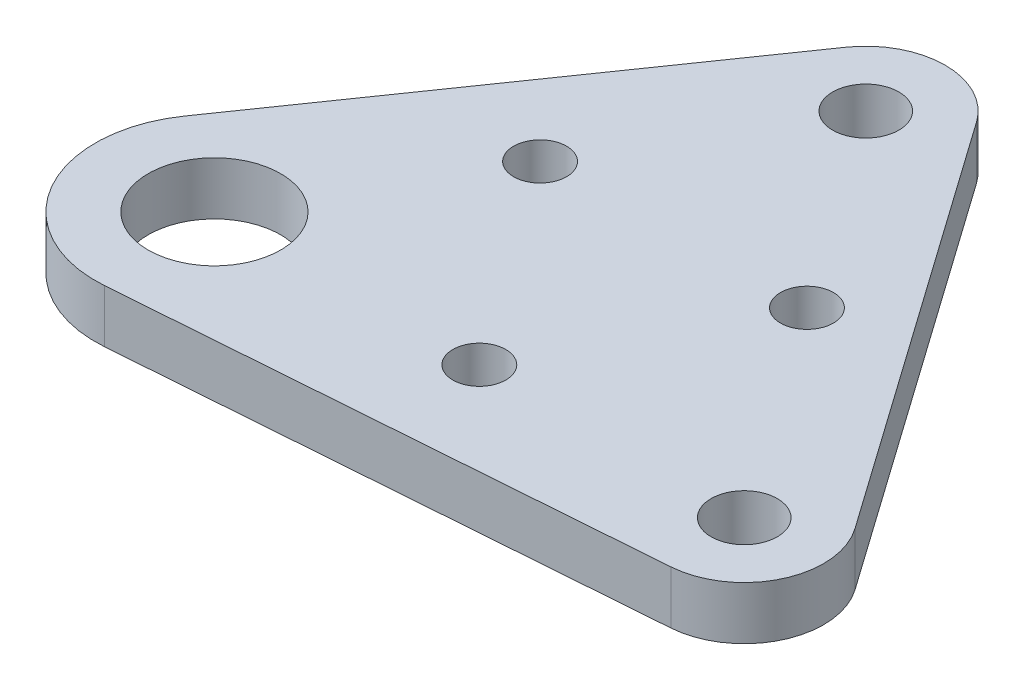
ISO-10303-21;
HEADER;
FILE_DESCRIPTION(('STEP AP214'),'2;1');
FILE_NAME('part.step','',(''),(''),'','','');
FILE_SCHEMA(('AUTOMOTIVE_DESIGN { 1 0 10303 214 1 1 1 1 }'));
ENDSEC;
DATA;
#1=APPLICATION_CONTEXT('core data for automotive mechanical design processes');
#2=APPLICATION_PROTOCOL_DEFINITION('international standard','automotive_design',2000,#1);
#3=PRODUCT_CONTEXT('',#1,'mechanical');
#4=PRODUCT('Part','Part','',(#3));
#5=PRODUCT_RELATED_PRODUCT_CATEGORY('part','',(#4));
#6=PRODUCT_DEFINITION_FORMATION('','',#4);
#7=PRODUCT_DEFINITION_CONTEXT('part definition',#1,'design');
#8=PRODUCT_DEFINITION('design','',#6,#7);
#9=PRODUCT_DEFINITION_SHAPE('','',#8);
#10=(LENGTH_UNIT() NAMED_UNIT(*) SI_UNIT(.MILLI.,.METRE.));
#11=(NAMED_UNIT(*) PLANE_ANGLE_UNIT() SI_UNIT($,.RADIAN.));
#12=(NAMED_UNIT(*) SI_UNIT($,.STERADIAN.) SOLID_ANGLE_UNIT());
#13=UNCERTAINTY_MEASURE_WITH_UNIT(LENGTH_MEASURE(1.E-05),#10,'distance_accuracy_value','');
#14=(GEOMETRIC_REPRESENTATION_CONTEXT(3) GLOBAL_UNCERTAINTY_ASSIGNED_CONTEXT((#13)) GLOBAL_UNIT_ASSIGNED_CONTEXT((#10,
#11,#12)) REPRESENTATION_CONTEXT('',''));
#15=CARTESIAN_POINT('',(0.,0.,0.));
#16=DIRECTION('',(0.,0.,1.));
#17=DIRECTION('',(1.,0.,0.));
#18=AXIS2_PLACEMENT_3D('',#15,#16,#17);
#19=CARTESIAN_POINT('',(63.5,6.35,0.));
#20=DIRECTION('',(0.,1.,0.));
#21=DIRECTION('',(0.,0.,1.));
#22=AXIS2_PLACEMENT_3D('',#19,#20,#21);
#23=PLANE('',#22);
#24=CARTESIAN_POINT('',(31.75,6.35,0.));
#25=DIRECTION('',(0.,1.,0.));
#26=DIRECTION('',(0.,0.,1.));
#27=AXIS2_PLACEMENT_3D('',#24,#25,#26);
#28=CIRCLE('',#27,3.175);
#29=CARTESIAN_POINT('',(31.75,6.35,3.175));
#30=VERTEX_POINT('',#29);
#31=EDGE_CURVE('E196',#30,#30,#28,.T.);
#32=ORIENTED_EDGE('',*,*,#31,.F.);
#33=EDGE_LOOP('',(#32));
#34=FACE_BOUND('',#33,.T.);
#35=CARTESIAN_POINT('',(63.5,6.35,0.));
#36=DIRECTION('',(0.,1.,0.));
#37=DIRECTION('',(0.,0.,1.));
#38=AXIS2_PLACEMENT_3D('',#35,#36,#37);
#39=CIRCLE('',#38,3.96875);
#40=CARTESIAN_POINT('',(63.5,6.35,3.96875));
#41=VERTEX_POINT('',#40);
#42=EDGE_CURVE('E208',#41,#41,#39,.T.);
#43=ORIENTED_EDGE('',*,*,#42,.F.);
#44=EDGE_LOOP('',(#43));
#45=FACE_BOUND('',#44,.T.);
#46=CARTESIAN_POINT('',(28.5750000000002,6.35,-49.4933518262805));
#47=DIRECTION('',(0.,1.,0.));
#48=DIRECTION('',(0.,0.,1.));
#49=AXIS2_PLACEMENT_3D('',#46,#47,#48);
#50=CIRCLE('',#49,3.96874999999999);
#51=CARTESIAN_POINT('',(28.5750000000002,6.35,-45.5246018262805));
#52=VERTEX_POINT('',#51);
#53=EDGE_CURVE('E120',#52,#52,#50,.T.);
#54=ORIENTED_EDGE('',*,*,#53,.F.);
#55=EDGE_LOOP('',(#54));
#56=FACE_BOUND('',#55,.T.);
#57=CARTESIAN_POINT('',(63.5,6.35,0.));
#58=DIRECTION('',(0.,1.,0.));
#59=DIRECTION('',(0.,0.,1.));
#60=AXIS2_PLACEMENT_3D('',#57,#58,#59);
#61=CIRCLE('',#60,9.52500000000001);
#62=CARTESIAN_POINT('',(64.214375,6.35,9.49817315905407));
#63=VERTEX_POINT('',#62);
#64=CARTESIAN_POINT('',(71.282469535705,6.35,-5.49170218837694));
#65=VERTEX_POINT('',#64);
#66=EDGE_CURVE('E127',#63,#65,#61,.T.);
#67=ORIENTED_EDGE('',*,*,#66,.T.);
#68=DIRECTION('',(-0.576556660197054,0.,-0.817057169102884));
#69=VECTOR('',#68,1.);
#70=CARTESIAN_POINT('',(36.3574695357052,6.35,-54.9850540146575));
#71=LINE('',#70,#69);
#72=CARTESIAN_POINT('',(36.3574695357052,6.35,-54.9850540146575));
#73=VERTEX_POINT('',#72);
#74=EDGE_CURVE('E85',#65,#73,#71,.T.);
#75=ORIENTED_EDGE('',*,*,#74,.T.);
#76=CARTESIAN_POINT('',(28.5750000000002,6.35,-49.4933518262805));
#77=DIRECTION('',(0.,1.,0.));
#78=DIRECTION('',(0.,0.,1.));
#79=AXIS2_PLACEMENT_3D('',#76,#77,#78);
#80=CIRCLE('',#79,9.52499999999999);
#81=CARTESIAN_POINT('',(20.7516749140458,6.35,-54.9266942229528));
#82=VERTEX_POINT('',#81);
#83=EDGE_CURVE('E98',#73,#82,#80,.T.);
#84=ORIENTED_EDGE('',*,*,#83,.T.);
#85=DIRECTION('',(-0.570429647944599,0.,0.821346465716996));
#86=VECTOR('',#85,1.);
#87=CARTESIAN_POINT('',(-11.7349876289316,6.35,-8.15001359500845));
#88=LINE('',#87,#86);
#89=CARTESIAN_POINT('',(-11.7349876289316,6.35,-8.15001359500845));
#90=VERTEX_POINT('',#89);
#91=EDGE_CURVE('E92',#82,#90,#88,.T.);
#92=ORIENTED_EDGE('',*,*,#91,.T.);
#93=CARTESIAN_POINT('',(0.,6.35,0.));
#94=DIRECTION('',(0.,1.,0.));
#95=DIRECTION('',(0.,0.,1.));
#96=AXIS2_PLACEMENT_3D('',#93,#94,#95);
#97=CIRCLE('',#96,14.2875);
#98=CARTESIAN_POINT('',(1.0715625,6.35,14.2472597385811));
#99=VERTEX_POINT('',#98);
#100=EDGE_CURVE('E96',#90,#99,#97,.T.);
#101=ORIENTED_EDGE('',*,*,#100,.T.);
#102=DIRECTION('',(0.997183533758957,0.,-0.075));
#103=VECTOR('',#102,1.);
#104=CARTESIAN_POINT('',(1.0715625,6.35,14.2472597385811));
#105=LINE('',#104,#103);
#106=EDGE_CURVE('E48',#99,#63,#105,.T.);
#107=ORIENTED_EDGE('',*,*,#106,.T.);
#108=EDGE_LOOP('',(#67,#75,#84,#92,#101,#107));
#109=FACE_BOUND('',#108,.T.);
#110=CARTESIAN_POINT('',(0.,6.35,0.));
#111=DIRECTION('',(0.,1.,0.));
#112=DIRECTION('',(0.,0.,1.));
#113=AXIS2_PLACEMENT_3D('',#110,#111,#112);
#114=CIRCLE('',#113,7.9375);
#115=CARTESIAN_POINT('',(0.,6.35,7.9375));
#116=VERTEX_POINT('',#115);
#117=EDGE_CURVE('E214',#116,#116,#114,.T.);
#118=ORIENTED_EDGE('',*,*,#117,.F.);
#119=EDGE_LOOP('',(#118));
#120=FACE_BOUND('',#119,.T.);
#121=CARTESIAN_POINT('',(14.2875000000001,6.35,-24.7466759131403));
#122=DIRECTION('',(0.,1.,0.));
#123=DIRECTION('',(0.,0.,1.));
#124=AXIS2_PLACEMENT_3D('',#121,#122,#123);
#125=CIRCLE('',#124,3.175);
#126=CARTESIAN_POINT('',(14.2875000000001,6.35,-21.5716759131403));
#127=VERTEX_POINT('',#126);
#128=EDGE_CURVE('E202',#127,#127,#125,.T.);
#129=ORIENTED_EDGE('',*,*,#128,.F.);
#130=EDGE_LOOP('',(#129));
#131=FACE_BOUND('',#130,.T.);
#132=CARTESIAN_POINT('',(45.471967278667,6.35,-25.5481107004335));
#133=DIRECTION('',(0.,1.,0.));
#134=DIRECTION('',(0.,0.,1.));
#135=AXIS2_PLACEMENT_3D('',#132,#133,#134);
#136=CIRCLE('',#135,3.175);
#137=CARTESIAN_POINT('',(45.471967278667,6.35,-22.3731107004335));
#138=VERTEX_POINT('',#137);
#139=EDGE_CURVE('E187',#138,#138,#136,.T.);
#140=ORIENTED_EDGE('',*,*,#139,.F.);
#141=EDGE_LOOP('',(#140));
#142=FACE_BOUND('',#141,.T.);
#143=ADVANCED_FACE('F31',(#34,#45,#56,#109,#120,#131,#142),#23,.T.);
#144=CARTESIAN_POINT('',(63.5,0.,0.));
#145=DIRECTION('',(0.,1.,0.));
#146=DIRECTION('',(0.,0.,1.));
#147=AXIS2_PLACEMENT_3D('',#144,#145,#146);
#148=PLANE('',#147);
#149=CARTESIAN_POINT('',(31.75,0.,0.));
#150=DIRECTION('',(0.,1.,0.));
#151=DIRECTION('',(0.,0.,1.));
#152=AXIS2_PLACEMENT_3D('',#149,#150,#151);
#153=CIRCLE('',#152,3.175);
#154=CARTESIAN_POINT('',(31.75,0.,3.175));
#155=VERTEX_POINT('',#154);
#156=EDGE_CURVE('E193',#155,#155,#153,.T.);
#157=ORIENTED_EDGE('',*,*,#156,.T.);
#158=EDGE_LOOP('',(#157));
#159=FACE_BOUND('',#158,.T.);
#160=CARTESIAN_POINT('',(63.5,0.,0.));
#161=DIRECTION('',(0.,1.,0.));
#162=DIRECTION('',(0.,0.,1.));
#163=AXIS2_PLACEMENT_3D('',#160,#161,#162);
#164=CIRCLE('',#163,3.96875);
#165=CARTESIAN_POINT('',(63.5,0.,3.96875));
#166=VERTEX_POINT('',#165);
#167=EDGE_CURVE('E205',#166,#166,#164,.T.);
#168=ORIENTED_EDGE('',*,*,#167,.T.);
#169=EDGE_LOOP('',(#168));
#170=FACE_BOUND('',#169,.T.);
#171=CARTESIAN_POINT('',(28.5750000000002,0.,-49.4933518262805));
#172=DIRECTION('',(0.,1.,0.));
#173=DIRECTION('',(0.,0.,1.));
#174=AXIS2_PLACEMENT_3D('',#171,#172,#173);
#175=CIRCLE('',#174,3.96874999999999);
#176=CARTESIAN_POINT('',(28.5750000000002,0.,-45.5246018262805));
#177=VERTEX_POINT('',#176);
#178=EDGE_CURVE('E217',#177,#177,#175,.T.);
#179=ORIENTED_EDGE('',*,*,#178,.T.);
#180=EDGE_LOOP('',(#179));
#181=FACE_BOUND('',#180,.T.);
#182=CARTESIAN_POINT('',(63.5,0.,0.));
#183=DIRECTION('',(0.,1.,0.));
#184=DIRECTION('',(0.,0.,1.));
#185=AXIS2_PLACEMENT_3D('',#182,#183,#184);
#186=CIRCLE('',#185,9.52500000000001);
#187=CARTESIAN_POINT('',(64.214375,0.,9.49817315905407));
#188=VERTEX_POINT('',#187);
#189=CARTESIAN_POINT('',(71.282469535705,0.,-5.49170218837694));
#190=VERTEX_POINT('',#189);
#191=EDGE_CURVE('E116',#188,#190,#186,.T.);
#192=ORIENTED_EDGE('',*,*,#191,.F.);
#193=DIRECTION('',(0.997183533758957,0.,-0.075));
#194=VECTOR('',#193,1.);
#195=CARTESIAN_POINT('',(1.0715625,0.,14.2472597385811));
#196=LINE('',#195,#194);
#197=CARTESIAN_POINT('',(1.0715625,0.,14.2472597385811));
#198=VERTEX_POINT('',#197);
#199=EDGE_CURVE('E77',#198,#188,#196,.T.);
#200=ORIENTED_EDGE('',*,*,#199,.F.);
#201=CARTESIAN_POINT('',(0.,0.,0.));
#202=DIRECTION('',(0.,1.,0.));
#203=DIRECTION('',(0.,0.,1.));
#204=AXIS2_PLACEMENT_3D('',#201,#202,#203);
#205=CIRCLE('',#204,14.2875);
#206=CARTESIAN_POINT('',(-11.7349876289316,0.,-8.15001359500845));
#207=VERTEX_POINT('',#206);
#208=EDGE_CURVE('E71',#207,#198,#205,.T.);
#209=ORIENTED_EDGE('',*,*,#208,.F.);
#210=DIRECTION('',(-0.570429647944599,0.,0.821346465716996));
#211=VECTOR('',#210,1.);
#212=CARTESIAN_POINT('',(-11.7349876289316,0.,-8.15001359500845));
#213=LINE('',#212,#211);
#214=CARTESIAN_POINT('',(20.7516749140458,0.,-54.9266942229528));
#215=VERTEX_POINT('',#214);
#216=EDGE_CURVE('E106',#215,#207,#213,.T.);
#217=ORIENTED_EDGE('',*,*,#216,.F.);
#218=CARTESIAN_POINT('',(28.5750000000002,0.,-49.4933518262805));
#219=DIRECTION('',(0.,1.,0.));
#220=DIRECTION('',(0.,0.,1.));
#221=AXIS2_PLACEMENT_3D('',#218,#219,#220);
#222=CIRCLE('',#221,9.52499999999999);
#223=CARTESIAN_POINT('',(36.3574695357052,0.,-54.9850540146575));
#224=VERTEX_POINT('',#223);
#225=EDGE_CURVE('E122',#224,#215,#222,.T.);
#226=ORIENTED_EDGE('',*,*,#225,.F.);
#227=DIRECTION('',(-0.576556660197054,0.,-0.817057169102884));
#228=VECTOR('',#227,1.);
#229=CARTESIAN_POINT('',(36.3574695357052,0.,-54.9850540146575));
#230=LINE('',#229,#228);
#231=EDGE_CURVE('E119',#190,#224,#230,.T.);
#232=ORIENTED_EDGE('',*,*,#231,.F.);
#233=EDGE_LOOP('',(#192,#200,#209,#217,#226,#232));
#234=FACE_BOUND('',#233,.T.);
#235=CARTESIAN_POINT('',(0.,0.,0.));
#236=DIRECTION('',(0.,1.,0.));
#237=DIRECTION('',(0.,0.,1.));
#238=AXIS2_PLACEMENT_3D('',#235,#236,#237);
#239=CIRCLE('',#238,7.9375);
#240=CARTESIAN_POINT('',(0.,0.,7.9375));
#241=VERTEX_POINT('',#240);
#242=EDGE_CURVE('E211',#241,#241,#239,.T.);
#243=ORIENTED_EDGE('',*,*,#242,.T.);
#244=EDGE_LOOP('',(#243));
#245=FACE_BOUND('',#244,.T.);
#246=CARTESIAN_POINT('',(14.2875000000001,0.,-24.7466759131403));
#247=DIRECTION('',(0.,1.,0.));
#248=DIRECTION('',(0.,0.,1.));
#249=AXIS2_PLACEMENT_3D('',#246,#247,#248);
#250=CIRCLE('',#249,3.175);
#251=CARTESIAN_POINT('',(14.2875000000001,0.,-21.5716759131403));
#252=VERTEX_POINT('',#251);
#253=EDGE_CURVE('E199',#252,#252,#250,.T.);
#254=ORIENTED_EDGE('',*,*,#253,.T.);
#255=EDGE_LOOP('',(#254));
#256=FACE_BOUND('',#255,.T.);
#257=CARTESIAN_POINT('',(45.471967278667,0.,-25.5481107004335));
#258=DIRECTION('',(0.,1.,0.));
#259=DIRECTION('',(0.,0.,1.));
#260=AXIS2_PLACEMENT_3D('',#257,#258,#259);
#261=CIRCLE('',#260,3.175);
#262=CARTESIAN_POINT('',(45.471967278667,0.,-22.3731107004335));
#263=VERTEX_POINT('',#262);
#264=EDGE_CURVE('E190',#263,#263,#261,.T.);
#265=ORIENTED_EDGE('',*,*,#264,.T.);
#266=EDGE_LOOP('',(#265));
#267=FACE_BOUND('',#266,.T.);
#268=ADVANCED_FACE('F136',(#159,#170,#181,#234,#245,#256,#267),#148,.F.);
#269=CARTESIAN_POINT('',(63.5,6.35,0.));
#270=DIRECTION('',(0.,-1.,0.));
#271=DIRECTION('',(0.,0.,-1.));
#272=AXIS2_PLACEMENT_3D('',#269,#270,#271);
#273=CYLINDRICAL_SURFACE('',#272,9.52500000000001);
#274=ORIENTED_EDGE('',*,*,#191,.T.);
#275=DIRECTION('',(0.,-1.,0.));
#276=VECTOR('',#275,1.);
#277=CARTESIAN_POINT('',(71.282469535705,6.35,-5.49170218837694));
#278=LINE('',#277,#276);
#279=EDGE_CURVE('E11',#65,#190,#278,.T.);
#280=ORIENTED_EDGE('',*,*,#279,.F.);
#281=ORIENTED_EDGE('',*,*,#66,.F.);
#282=DIRECTION('',(0.,-1.,0.));
#283=VECTOR('',#282,1.);
#284=CARTESIAN_POINT('',(64.214375,6.35,9.49817315905407));
#285=LINE('',#284,#283);
#286=EDGE_CURVE('E112',#63,#188,#285,.T.);
#287=ORIENTED_EDGE('',*,*,#286,.T.);
#288=EDGE_LOOP('',(#274,#280,#281,#287));
#289=FACE_BOUND('',#288,.T.);
#290=ADVANCED_FACE('F33',(#289),#273,.T.);
#291=CARTESIAN_POINT('',(36.3574695357052,6.35,-54.9850540146575));
#292=DIRECTION('',(-0.817057169102884,0.,0.576556660197054));
#293=DIRECTION('',(0.576556660197054,0.,0.817057169102884));
#294=AXIS2_PLACEMENT_3D('',#291,#292,#293);
#295=PLANE('',#294);
#296=ORIENTED_EDGE('',*,*,#231,.T.);
#297=DIRECTION('',(0.,-1.,0.));
#298=VECTOR('',#297,1.);
#299=CARTESIAN_POINT('',(36.3574695357052,6.35,-54.9850540146575));
#300=LINE('',#299,#298);
#301=EDGE_CURVE('E40',#73,#224,#300,.T.);
#302=ORIENTED_EDGE('',*,*,#301,.F.);
#303=ORIENTED_EDGE('',*,*,#74,.F.);
#304=ORIENTED_EDGE('',*,*,#279,.T.);
#305=EDGE_LOOP('',(#296,#302,#303,#304));
#306=FACE_BOUND('',#305,.T.);
#307=ADVANCED_FACE('F292',(#306),#295,.F.);
#308=CARTESIAN_POINT('',(28.5750000000002,6.35,-49.4933518262805));
#309=DIRECTION('',(0.,-1.,0.));
#310=DIRECTION('',(0.,0.,-1.));
#311=AXIS2_PLACEMENT_3D('',#308,#309,#310);
#312=CYLINDRICAL_SURFACE('',#311,9.52499999999999);
#313=ORIENTED_EDGE('',*,*,#225,.T.);
#314=DIRECTION('',(0.,-1.,0.));
#315=VECTOR('',#314,1.);
#316=CARTESIAN_POINT('',(20.7516749140458,6.35,-54.9266942229528));
#317=LINE('',#316,#315);
#318=EDGE_CURVE('E107',#82,#215,#317,.T.);
#319=ORIENTED_EDGE('',*,*,#318,.F.);
#320=ORIENTED_EDGE('',*,*,#83,.F.);
#321=ORIENTED_EDGE('',*,*,#301,.T.);
#322=EDGE_LOOP('',(#313,#319,#320,#321));
#323=FACE_BOUND('',#322,.T.);
#324=ADVANCED_FACE('F133',(#323),#312,.T.);
#325=CARTESIAN_POINT('',(-11.7349876289316,6.35,-8.15001359500845));
#326=DIRECTION('',(0.821346465716996,0.,0.570429647944599));
#327=DIRECTION('',(0.570429647944599,0.,-0.821346465716996));
#328=AXIS2_PLACEMENT_3D('',#325,#326,#327);
#329=PLANE('',#328);
#330=ORIENTED_EDGE('',*,*,#216,.T.);
#331=DIRECTION('',(0.,-1.,0.));
#332=VECTOR('',#331,1.);
#333=CARTESIAN_POINT('',(-11.7349876289316,6.35,-8.15001359500845));
#334=LINE('',#333,#332);
#335=EDGE_CURVE('E103',#90,#207,#334,.T.);
#336=ORIENTED_EDGE('',*,*,#335,.F.);
#337=ORIENTED_EDGE('',*,*,#91,.F.);
#338=ORIENTED_EDGE('',*,*,#318,.T.);
#339=EDGE_LOOP('',(#330,#336,#337,#338));
#340=FACE_BOUND('',#339,.T.);
#341=ADVANCED_FACE('F104',(#340),#329,.F.);
#342=CARTESIAN_POINT('',(0.,6.35,0.));
#343=DIRECTION('',(0.,-1.,0.));
#344=DIRECTION('',(0.,0.,-1.));
#345=AXIS2_PLACEMENT_3D('',#342,#343,#344);
#346=CYLINDRICAL_SURFACE('',#345,14.2875);
#347=ORIENTED_EDGE('',*,*,#208,.T.);
#348=DIRECTION('',(0.,-1.,0.));
#349=VECTOR('',#348,1.);
#350=CARTESIAN_POINT('',(1.0715625,6.35,14.2472597385811));
#351=LINE('',#350,#349);
#352=EDGE_CURVE('E108',#99,#198,#351,.T.);
#353=ORIENTED_EDGE('',*,*,#352,.F.);
#354=ORIENTED_EDGE('',*,*,#100,.F.);
#355=ORIENTED_EDGE('',*,*,#335,.T.);
#356=EDGE_LOOP('',(#347,#353,#354,#355));
#357=FACE_BOUND('',#356,.T.);
#358=ADVANCED_FACE('F110',(#357),#346,.T.);
#359=CARTESIAN_POINT('',(1.0715625,6.35,14.2472597385811));
#360=DIRECTION('',(-0.075,0.,-0.997183533758957));
#361=DIRECTION('',(-0.997183533758957,0.,0.075));
#362=AXIS2_PLACEMENT_3D('',#359,#360,#361);
#363=PLANE('',#362);
#364=ORIENTED_EDGE('',*,*,#199,.T.);
#365=ORIENTED_EDGE('',*,*,#286,.F.);
#366=ORIENTED_EDGE('',*,*,#106,.F.);
#367=ORIENTED_EDGE('',*,*,#352,.T.);
#368=EDGE_LOOP('',(#364,#365,#366,#367));
#369=FACE_BOUND('',#368,.T.);
#370=ADVANCED_FACE('F141',(#369),#363,.F.);
#371=CARTESIAN_POINT('',(28.5750000000002,6.35,-49.4933518262805));
#372=DIRECTION('',(0.,-1.,0.));
#373=DIRECTION('',(0.,0.,-1.));
#374=AXIS2_PLACEMENT_3D('',#371,#372,#373);
#375=CYLINDRICAL_SURFACE('',#374,3.96874999999999);
#376=ORIENTED_EDGE('',*,*,#53,.T.);
#377=EDGE_LOOP('',(#376));
#378=FACE_BOUND('',#377,.T.);
#379=ORIENTED_EDGE('',*,*,#178,.F.);
#380=EDGE_LOOP('',(#379));
#381=FACE_BOUND('',#380,.T.);
#382=ADVANCED_FACE('F143',(#378,#381),#375,.F.);
#383=CARTESIAN_POINT('',(0.,6.35,0.));
#384=DIRECTION('',(0.,-1.,0.));
#385=DIRECTION('',(0.,0.,-1.));
#386=AXIS2_PLACEMENT_3D('',#383,#384,#385);
#387=CYLINDRICAL_SURFACE('',#386,7.9375);
#388=ORIENTED_EDGE('',*,*,#117,.T.);
#389=EDGE_LOOP('',(#388));
#390=FACE_BOUND('',#389,.T.);
#391=ORIENTED_EDGE('',*,*,#242,.F.);
#392=EDGE_LOOP('',(#391));
#393=FACE_BOUND('',#392,.T.);
#394=ADVANCED_FACE('F149',(#390,#393),#387,.F.);
#395=CARTESIAN_POINT('',(63.5,6.35,0.));
#396=DIRECTION('',(0.,-1.,0.));
#397=DIRECTION('',(0.,0.,-1.));
#398=AXIS2_PLACEMENT_3D('',#395,#396,#397);
#399=CYLINDRICAL_SURFACE('',#398,3.96875);
#400=ORIENTED_EDGE('',*,*,#42,.T.);
#401=EDGE_LOOP('',(#400));
#402=FACE_BOUND('',#401,.T.);
#403=ORIENTED_EDGE('',*,*,#167,.F.);
#404=EDGE_LOOP('',(#403));
#405=FACE_BOUND('',#404,.T.);
#406=ADVANCED_FACE('F166',(#402,#405),#399,.F.);
#407=CARTESIAN_POINT('',(14.2875000000001,6.35,-24.7466759131403));
#408=DIRECTION('',(0.,-1.,0.));
#409=DIRECTION('',(0.,0.,-1.));
#410=AXIS2_PLACEMENT_3D('',#407,#408,#409);
#411=CYLINDRICAL_SURFACE('',#410,3.175);
#412=ORIENTED_EDGE('',*,*,#128,.T.);
#413=EDGE_LOOP('',(#412));
#414=FACE_BOUND('',#413,.T.);
#415=ORIENTED_EDGE('',*,*,#253,.F.);
#416=EDGE_LOOP('',(#415));
#417=FACE_BOUND('',#416,.T.);
#418=ADVANCED_FACE('F170',(#414,#417),#411,.F.);
#419=CARTESIAN_POINT('',(31.75,6.35,0.));
#420=DIRECTION('',(0.,-1.,0.));
#421=DIRECTION('',(0.,0.,-1.));
#422=AXIS2_PLACEMENT_3D('',#419,#420,#421);
#423=CYLINDRICAL_SURFACE('',#422,3.175);
#424=ORIENTED_EDGE('',*,*,#31,.T.);
#425=EDGE_LOOP('',(#424));
#426=FACE_BOUND('',#425,.T.);
#427=ORIENTED_EDGE('',*,*,#156,.F.);
#428=EDGE_LOOP('',(#427));
#429=FACE_BOUND('',#428,.T.);
#430=ADVANCED_FACE('F174',(#426,#429),#423,.F.);
#431=CARTESIAN_POINT('',(45.471967278667,6.35,-25.5481107004335));
#432=DIRECTION('',(0.,-1.,0.));
#433=DIRECTION('',(0.,0.,-1.));
#434=AXIS2_PLACEMENT_3D('',#431,#432,#433);
#435=CYLINDRICAL_SURFACE('',#434,3.175);
#436=ORIENTED_EDGE('',*,*,#139,.T.);
#437=EDGE_LOOP('',(#436));
#438=FACE_BOUND('',#437,.T.);
#439=ORIENTED_EDGE('',*,*,#264,.F.);
#440=EDGE_LOOP('',(#439));
#441=FACE_BOUND('',#440,.T.);
#442=ADVANCED_FACE('F178',(#438,#441),#435,.F.);
#443=CLOSED_SHELL('',(#143,#268,#290,#307,#324,#341,#358,#370,#382,#394,#406,#418,#430,#442));
#444=MANIFOLD_SOLID_BREP('B2',#443);
#445=ADVANCED_BREP_SHAPE_REPRESENTATION('',(#18,#444),#14);
#446=SHAPE_DEFINITION_REPRESENTATION(#9,#445);
ENDSEC;
END-ISO-10303-21;
